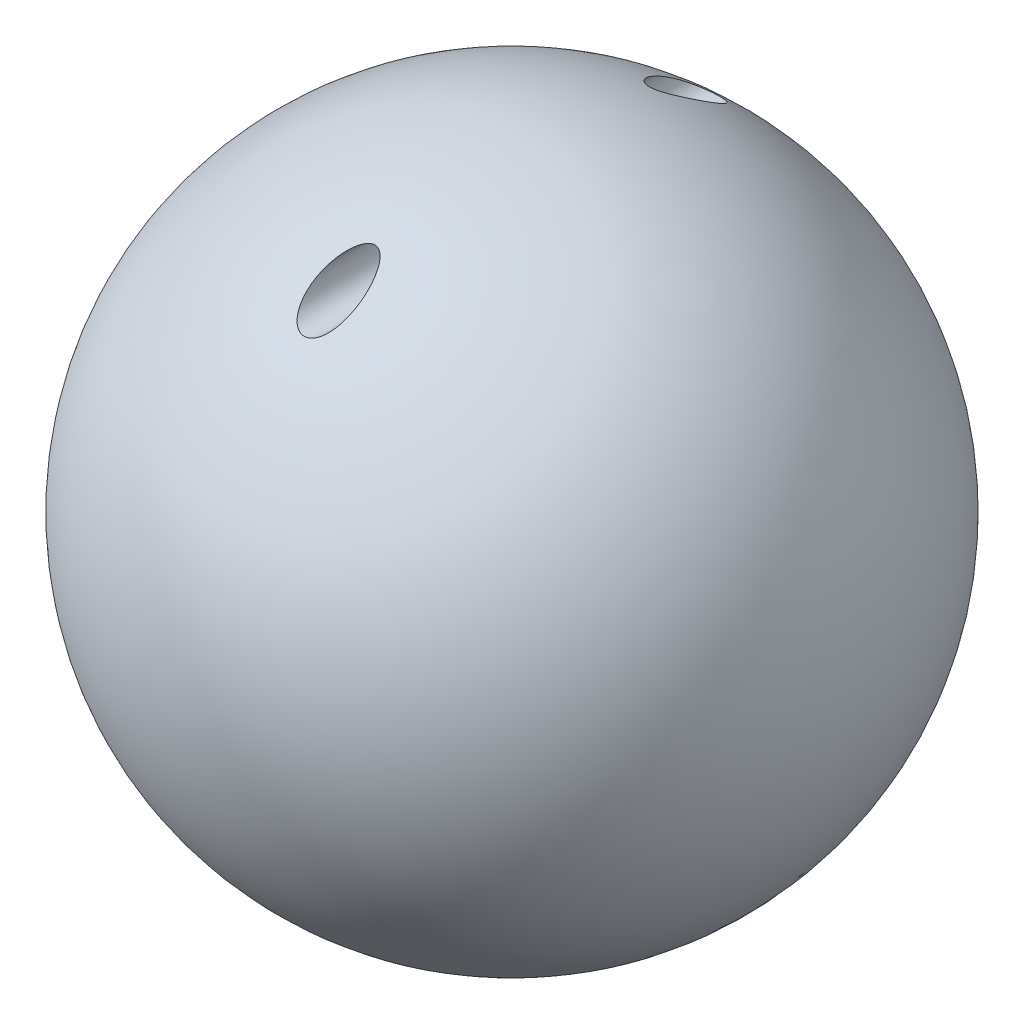
ISO-10303-21;
HEADER;
FILE_DESCRIPTION(('STEP AP214'),'2;1');
FILE_NAME('part.step','',(''),(''),'','','');
FILE_SCHEMA(('AUTOMOTIVE_DESIGN { 1 0 10303 214 1 1 1 1 }'));
ENDSEC;
DATA;
#1=APPLICATION_CONTEXT('core data for automotive mechanical design processes');
#2=APPLICATION_PROTOCOL_DEFINITION('international standard','automotive_design',2000,#1);
#3=PRODUCT_CONTEXT('',#1,'mechanical');
#4=PRODUCT('Part','Part','',(#3));
#5=PRODUCT_RELATED_PRODUCT_CATEGORY('part','',(#4));
#6=PRODUCT_DEFINITION_FORMATION('','',#4);
#7=PRODUCT_DEFINITION_CONTEXT('part definition',#1,'design');
#8=PRODUCT_DEFINITION('design','',#6,#7);
#9=PRODUCT_DEFINITION_SHAPE('','',#8);
#10=(LENGTH_UNIT() NAMED_UNIT(*) SI_UNIT(.MILLI.,.METRE.));
#11=(NAMED_UNIT(*) PLANE_ANGLE_UNIT() SI_UNIT($,.RADIAN.));
#12=(NAMED_UNIT(*) SI_UNIT($,.STERADIAN.) SOLID_ANGLE_UNIT());
#13=UNCERTAINTY_MEASURE_WITH_UNIT(LENGTH_MEASURE(1.E-05),#10,'distance_accuracy_value','');
#14=(GEOMETRIC_REPRESENTATION_CONTEXT(3) GLOBAL_UNCERTAINTY_ASSIGNED_CONTEXT((#13)) GLOBAL_UNIT_ASSIGNED_CONTEXT((#10,
#11,#12)) REPRESENTATION_CONTEXT('',''));
#15=CARTESIAN_POINT('',(0.,0.,0.));
#16=DIRECTION('',(0.,0.,1.));
#17=DIRECTION('',(1.,0.,0.));
#18=AXIS2_PLACEMENT_3D('',#15,#16,#17);
#19=CARTESIAN_POINT('',(0.,38.1,0.));
#20=DIRECTION('',(0.,-1.,0.));
#21=DIRECTION('',(-1.,0.,0.));
#22=AXIS2_PLACEMENT_3D('',#19,#20,#21);
#23=SPHERICAL_SURFACE('',#22,38.1);
#24=CARTESIAN_POINT('',(-0.956077152250891,67.8715067155588,-23.7561192860774));
#25=CARTESIAN_POINT('',(-1.08988025783361,67.9260513667573,-23.6823744984566));
#26=CARTESIAN_POINT('',(-1.21326743899603,67.9897236836018,-23.595944044695));
#27=CARTESIAN_POINT('',(-1.38245133822087,68.0936434214308,-23.4539327018622));
#28=CARTESIAN_POINT('',(-1.43636270429904,68.1298318840705,-23.4043320713231));
#29=CARTESIAN_POINT('',(-1.53915764986774,68.2044504216141,-23.3017100456448));
#30=CARTESIAN_POINT('',(-1.58804321973003,68.242879599602,-23.2486900183361));
#31=CARTESIAN_POINT('',(-1.70202474016501,68.3391710427908,-23.1153561187657));
#32=CARTESIAN_POINT('',(-1.76450351567185,68.3979894594724,-23.0335057768095));
#33=CARTESIAN_POINT('',(-1.88045133763182,68.5181334805811,-22.8653691468867));
#34=CARTESIAN_POINT('',(-1.93391528459052,68.5794604798503,-22.7790803839759));
#35=CARTESIAN_POINT('',(-2.03264306330124,68.7037600930996,-22.6031471870782));
#36=CARTESIAN_POINT('',(-2.07790945517654,68.7667321862571,-22.5135038113377));
#37=CARTESIAN_POINT('',(-2.16101294414045,68.8937556274515,-22.3315625238091));
#38=CARTESIAN_POINT('',(-2.19884752331048,68.957807333311,-22.2392637244569));
#39=CARTESIAN_POINT('',(-2.29023888619759,69.1286306175194,-21.9915274705454));
#40=CARTESIAN_POINT('',(-2.33789614720392,69.2359457952872,-21.8342739677283));
#41=CARTESIAN_POINT('',(-2.41685245858484,69.4508407739648,-21.5158571745261));
#42=CARTESIAN_POINT('',(-2.44814084014505,69.5584207016595,-21.3546914056439));
#43=CARTESIAN_POINT('',(-2.49601013077729,69.7730905387479,-21.0293581867958));
#44=CARTESIAN_POINT('',(-2.51255690877714,69.8801787428163,-20.8651846644854));
#45=CARTESIAN_POINT('',(-2.53198148905861,70.0928818619394,-20.5351700859443));
#46=CARTESIAN_POINT('',(-2.53486241295354,70.1984971079571,-20.3693294192043));
#47=CARTESIAN_POINT('',(-2.52751851368362,70.4140976934869,-20.0265871107531));
#48=CARTESIAN_POINT('',(-2.5164875012691,70.5239591243888,-19.849625143675));
#49=CARTESIAN_POINT('',(-2.48040047848942,70.7409347163667,-19.4953961426119));
#50=CARTESIAN_POINT('',(-2.45534115811606,70.8480482228238,-19.3181290464757));
#51=CARTESIAN_POINT('',(-2.39131570748102,71.0586750333275,-18.9647187651516));
#52=CARTESIAN_POINT('',(-2.35239269139198,71.1621984189663,-18.7885737998475));
#53=CARTESIAN_POINT('',(-2.26014717954414,71.3654118302454,-18.4379301276782));
#54=CARTESIAN_POINT('',(-2.20683173487314,71.4651037057566,-18.2634306578682));
#55=CARTESIAN_POINT('',(-2.08844568801798,71.6538760419011,-17.9282936795957));
#56=CARTESIAN_POINT('',(-2.02432660149554,71.7432294150276,-17.767475162239));
#57=CARTESIAN_POINT('',(-1.88041636778336,71.9174128740521,-17.4497752171573));
#58=CARTESIAN_POINT('',(-1.80059296837571,72.0022331866224,-17.2929026539372));
#59=CARTESIAN_POINT('',(-1.66643873781881,72.1251878592967,-17.0625112303771));
#60=CARTESIAN_POINT('',(-1.61905016889227,72.1656470283897,-16.9861731523278));
#61=CARTESIAN_POINT('',(-1.51887006636147,72.2447043462872,-16.8360299388582));
#62=CARTESIAN_POINT('',(-1.46607624275999,72.2833016960382,-16.7622258948397));
#63=CARTESIAN_POINT('',(-1.35458752922106,72.3580335293003,-16.6184195243858));
#64=CARTESIAN_POINT('',(-1.29591742205753,72.3941773602733,-16.548403002704));
#65=CARTESIAN_POINT('',(-1.17162964818109,72.4635011598668,-16.4133079929228));
#66=CARTESIAN_POINT('',(-1.10602053169808,72.4966846852828,-16.3482235934545));
#67=CARTESIAN_POINT('',(-0.97807408607205,72.5540611011198,-16.2350789965344));
#68=CARTESIAN_POINT('',(-0.916937849856174,72.5788386906545,-16.185971062397));
#69=CARTESIAN_POINT('',(-0.78839292538733,72.6247962537562,-16.0945216757323));
#70=CARTESIAN_POINT('',(-0.720980926854238,72.6459743118441,-16.0521838265889));
#71=CARTESIAN_POINT('',(-0.578809374054807,72.6837444235261,-15.9764367147104));
#72=CARTESIAN_POINT('',(-0.503967364939758,72.7002748065313,-15.943147698144));
#73=CARTESIAN_POINT('',(-0.348661235789467,72.7267702258622,-15.8896853658634));
#74=CARTESIAN_POINT('',(-0.268213097449586,72.7367531434783,-15.8694763304023));
#75=CARTESIAN_POINT('',(-0.122946008658491,72.7474728911945,-15.8477645101311));
#76=CARTESIAN_POINT('',(-0.0587199757540719,72.7497931186611,-15.8430588904829));
#77=CARTESIAN_POINT('',(0.0696810927183511,72.7495126502474,-15.8436275883465));
#78=CARTESIAN_POINT('',(0.133856132752681,72.7469124475783,-15.8489009055954));
#79=CARTESIAN_POINT('',(0.260063393490717,72.7370654442156,-15.8688423139614));
#80=CARTESIAN_POINT('',(0.322102852308137,72.7298364004488,-15.8834745028131));
#81=CARTESIAN_POINT('',(0.443057173689312,72.7113582192844,-15.9207940438785));
#82=CARTESIAN_POINT('',(0.501969637588753,72.7001060455674,-15.9434874799583));
#83=CARTESIAN_POINT('',(0.648806652580205,72.666879312794,-16.0103102284532));
#84=CARTESIAN_POINT('',(0.733966241505925,72.6424578612857,-16.05926587545));
#85=CARTESIAN_POINT('',(0.894910065134815,72.5878241645033,-16.1681591802658));
#86=CARTESIAN_POINT('',(0.9706643551324,72.5575941667441,-16.2281304794821));
#87=CARTESIAN_POINT('',(1.10594871198591,72.4965127604386,-16.3485445521747));
#88=CARTESIAN_POINT('',(1.1663474327003,72.4660788468249,-16.4082410688943));
#89=CARTESIAN_POINT('',(1.28123415097531,72.4026770420953,-16.5318759481599));
#90=CARTESIAN_POINT('',(1.33571725264701,72.3697070900749,-16.5958177547292));
#91=CARTESIAN_POINT('',(1.43953368702129,72.3017193648293,-16.7268733351472));
#92=CARTESIAN_POINT('',(1.48885899122986,72.2666985276316,-16.7939918246317));
#93=CARTESIAN_POINT('',(1.5828783884395,72.1949957149199,-16.9305619695714));
#94=CARTESIAN_POINT('',(1.62757070752124,72.1583131108018,-17.0000145053283));
#95=CARTESIAN_POINT('',(1.75538167045828,72.0462148094897,-17.2109184433276));
#96=CARTESIAN_POINT('',(1.83231201374387,71.968695836089,-17.3550181599252));
#97=CARTESIAN_POINT('',(1.97238944480632,71.8093188017222,-17.6474986711386));
#98=CARTESIAN_POINT('',(2.03552376912335,71.7274568090584,-17.7958832874993));
#99=CARTESIAN_POINT('',(2.14972617979511,71.5599765970286,-18.0956193554151));
#100=CARTESIAN_POINT('',(2.20076663405765,71.4743502957629,-18.2469767615496));
#101=CARTESIAN_POINT('',(2.29159470101053,71.3000152418782,-18.5512914442253));
#102=CARTESIAN_POINT('',(2.33137987661872,71.2113058263407,-18.7042490598332));
#103=CARTESIAN_POINT('',(2.41310582295312,70.9975264812231,-19.0683400165411));
#104=CARTESIAN_POINT('',(2.45029445643085,70.8712588019878,-19.2798495465002));
#105=CARTESIAN_POINT('',(2.504809915498,70.6144632183509,-19.7029856642031));
#106=CARTESIAN_POINT('',(2.52212558672937,70.483932963665,-19.9146122510487));
#107=CARTESIAN_POINT('',(2.53620430584941,70.2199105371503,-20.3359464122866));
#108=CARTESIAN_POINT('',(2.53302110002668,70.086427024635,-20.5456575624858));
#109=CARTESIAN_POINT('',(2.50470600197659,69.8173198385547,-20.9621000431658));
#110=CARTESIAN_POINT('',(2.47959222926129,69.6816980225156,-21.1688336904244));
#111=CARTESIAN_POINT('',(2.42302478402421,69.475880731701,-21.4781136500631));
#112=CARTESIAN_POINT('',(2.40057511186407,69.4059020377669,-21.5824935401686));
#113=CARTESIAN_POINT('',(2.3487049202285,69.2660722345682,-21.7895800752184));
#114=CARTESIAN_POINT('',(2.31928597250485,69.1962211001098,-21.8922870918652));
#115=CARTESIAN_POINT('',(2.25289223363604,69.0570076949248,-22.0955746720912));
#116=CARTESIAN_POINT('',(2.21591859388269,68.9876453513672,-22.1961555571343));
#117=CARTESIAN_POINT('',(2.13371718011195,68.8499292208662,-22.394539318396));
#118=CARTESIAN_POINT('',(2.08849125078148,68.7815752122069,-22.4923428098279));
#119=CARTESIAN_POINT('',(1.96272479114456,68.6109503127462,-22.7349375837164));
#120=CARTESIAN_POINT('',(1.87610552509777,68.5097007880551,-22.8774585350329));
#121=CARTESIAN_POINT('',(1.7275974338744,68.3634866994852,-23.0815130686968));
#122=CARTESIAN_POINT('',(1.6750297563965,68.3157149697603,-23.1478787125466));
#123=CARTESIAN_POINT('',(1.56315353580656,68.2227122597962,-23.2765584778395));
#124=CARTESIAN_POINT('',(1.50384868973993,68.1774799062339,-23.3388747921334));
#125=CARTESIAN_POINT('',(1.36237111134381,68.0796091030647,-23.4732114657097));
#126=CARTESIAN_POINT('',(1.27817103492847,68.0279076357888,-23.5438174034787));
#127=CARTESIAN_POINT('',(1.09778981405228,67.9321256090879,-23.6741160191359));
#128=CARTESIAN_POINT('',(1.00162493260936,67.8880348954239,-23.7338232442588));
#129=CARTESIAN_POINT('',(0.817573843796583,67.8181056997736,-23.8282446911651));
#130=CARTESIAN_POINT('',(0.731758927543794,67.7903835810579,-23.865563809465));
#131=CARTESIAN_POINT('',(0.553619868798758,67.7436619264792,-23.9283567776533));
#132=CARTESIAN_POINT('',(0.461301183896006,67.7246551754309,-23.9538404259896));
#133=CARTESIAN_POINT('',(0.271612108284033,67.6968963517942,-23.9910307629647));
#134=CARTESIAN_POINT('',(0.174208753300914,67.6882230343145,-24.002631648614));
#135=CARTESIAN_POINT('',(-0.0215730424942193,67.6823269858007,-24.0105198065994));
#136=CARTESIAN_POINT('',(-0.119951238235744,67.6851014462249,-24.0068108349806));
#137=CARTESIAN_POINT('',(-0.302353056558344,67.7007699106189,-23.9858388441149));
#138=CARTESIAN_POINT('',(-0.386689312509422,67.7124175197854,-23.9702451362648));
#139=CARTESIAN_POINT('',(-0.551222896837466,67.7434194499842,-23.9286703599963));
#140=CARTESIAN_POINT('',(-0.631421687979475,67.7627710259597,-23.9026929914425));
#141=CARTESIAN_POINT('',(-0.751832248752979,67.7978699933195,-23.8554724034767));
#142=CARTESIAN_POINT('',(-0.793948526645847,67.8113855291012,-23.8372715457935));
#143=CARTESIAN_POINT('',(-0.876368918637927,67.8401735199978,-23.7984520898788));
#144=CARTESIAN_POINT('',(-0.916674665362088,67.8554443461964,-23.777835732902));
#145=CARTESIAN_POINT('',(-0.956077152250891,67.8715067155588,-23.7561192860774));
#146=B_SPLINE_CURVE_WITH_KNOTS('',3,(#24,#25,#26,#27,#28,#29,#30,#31,#32,#33,#34,#35,#36,#37,
#38,#39,#40,#41,#42,#43,#44,#45,#46,#47,#48,#49,#50,#51,#52,#53,#54,#55,#56,#57,#58,#59,#60,#61,
#62,#63,#64,#65,#66,#67,#68,#69,#70,#71,#72,#73,#74,#75,#76,#77,#78,#79,#80,#81,#82,#83,#84,#85,
#86,#87,#88,#89,#90,#91,#92,#93,#94,#95,#96,#97,#98,#99,#100,#101,#102,#103,#104,#105,#106,#107,
#108,#109,#110,#111,#112,#113,#114,#115,#116,#117,#118,#119,#120,#121,#122,#123,#124,#125,#126,
#127,#128,#129,#130,#131,#132,#133,#134,#135,#136,#137,#138,#139,#140,#141,#142,#143,#144,#145),
.UNSPECIFIED.,.T.,.F.,(4,2,2,2,2,2,2,2,2,2,2,2,2,2,2,2,2,2,2,2,2,2,2,2,2,2,2,2,2,2,2,2,2,2,2,2,
2,2,2,2,2,2,2,2,2,2,2,2,2,2,2,2,2,2,2,2,2,2,2,2,4),(0.,0.48641947934676,0.731412208073252,
0.976307535237751,1.33151600304147,1.68692473538572,2.04222228028265,2.39763999412192,
2.98549446777267,3.5737316139951,4.16332718612942,4.75278807381398,5.37803167608795,
6.00342286809922,6.62688592161603,7.25004408291804,7.833965825301,8.4190995375056,
8.71456632194752,9.01015880632031,9.30455332357016,9.59858922412656,9.84483993152131,
10.0912212729291,10.3407322595241,10.5895589561794,10.7819576421185,10.9743370435318,
11.1659828345087,11.3577735699506,11.6596902033161,11.9625446903611,12.232785040682,
12.503247369576,12.7741246152118,13.0451051966496,13.5866526542665,14.1286990258876,
14.671972174575,15.2153628671935,15.9618505007514,16.7087569206143,17.4537058150016,
18.1980397981132,18.5808444865357,18.9635629246565,19.3462230770623,19.7287977955614,
20.3120994106875,20.6034530563816,20.8946475860639,21.2578977322004,21.6206594211137,
21.912324244265,22.2037471691715,22.4973772163966,22.7909352301506,23.0494814176518,
23.3079355630102,23.4513089034757,23.5945502510808),.UNSPECIFIED.);
#147=CARTESIAN_POINT('',(-0.956077152250891,67.8715067155588,-23.7561192860774));
#148=VERTEX_POINT('',#147);
#149=EDGE_CURVE('E10',#148,#148,#146,.T.);
#150=ORIENTED_EDGE('',*,*,#149,.F.);
#151=EDGE_LOOP('',(#150));
#152=FACE_BOUND('',#151,.T.);
#153=CARTESIAN_POINT('',(-0.994738307856491,72.5461415537531,16.2506562254478));
#154=CARTESIAN_POINT('',(-1.07291557390278,72.5127577977565,16.3166333520263));
#155=CARTESIAN_POINT('',(-1.14617336766777,72.4768420136395,16.3872080872959));
#156=CARTESIAN_POINT('',(-1.28422559905736,72.4013533222182,16.5344967045047));
#157=CARTESIAN_POINT('',(-1.34900321399339,72.3617734037816,16.6112223166157));
#158=CARTESIAN_POINT('',(-1.4716986376198,72.2795363138753,16.7694721903049));
#159=CARTESIAN_POINT('',(-1.52956056553212,72.2368580399368,16.851028492122));
#160=CARTESIAN_POINT('',(-1.63885207238568,72.1492408322564,17.0172026690568));
#161=CARTESIAN_POINT('',(-1.69027819523971,72.1043007018844,17.1018221579571));
#162=CARTESIAN_POINT('',(-1.82390331357097,71.9781411805637,17.3375628218374));
#163=CARTESIAN_POINT('',(-1.90025984947556,71.8949877568207,17.4909684193262));
#164=CARTESIAN_POINT('',(-2.03838929695356,71.7241807925285,17.8018460774115));
#165=CARTESIAN_POINT('',(-2.10014901224253,71.6365232665175,17.9593216759284));
#166=CARTESIAN_POINT('',(-2.21054924512755,71.4576202413171,18.2764540849225));
#167=CARTESIAN_POINT('',(-2.2592088399394,71.3663801837117,18.4361073639596));
#168=CARTESIAN_POINT('',(-2.34442131943875,71.1807475577334,18.7567041702282));
#169=CARTESIAN_POINT('',(-2.38097813201117,71.0863560231232,18.9176472614568));
#170=CARTESIAN_POINT('',(-2.44558947940395,70.884953570257,19.256682594363));
#171=CARTESIAN_POINT('',(-2.4723840534328,70.7776427245922,19.4348373457619));
#172=CARTESIAN_POINT('',(-2.5118335343398,70.560136878119,19.7910118290448));
#173=CARTESIAN_POINT('',(-2.52448498290484,70.4499411786373,19.9690315172732));
#174=CARTESIAN_POINT('',(-2.53519325000556,70.2273372379979,20.3238986839107));
#175=CARTESIAN_POINT('',(-2.53326397607794,70.1149312071931,20.5007471183479));
#176=CARTESIAN_POINT('',(-2.51395391039261,69.8884747239421,20.8524992262387));
#177=CARTESIAN_POINT('',(-2.49657919673583,69.7744249357151,21.0274036372953));
#178=CARTESIAN_POINT('',(-2.45383404422005,69.5848024042859,21.3146624351409));
#179=CARTESIAN_POINT('',(-2.43325226549391,69.5094538894815,21.4278883568147));
#180=CARTESIAN_POINT('',(-2.38427284559108,69.3587356397535,21.6526115583047));
#181=CARTESIAN_POINT('',(-2.35587667071312,69.2833659114583,21.7641091582825));
#182=CARTESIAN_POINT('',(-2.29060081062474,69.1330233614997,21.9848468619308));
#183=CARTESIAN_POINT('',(-2.2537238069447,69.0580504220259,22.0940876672976));
#184=CARTESIAN_POINT('',(-2.1706683398258,68.9090781852226,22.3095898576937));
#185=CARTESIAN_POINT('',(-2.12449267792224,68.8350786017731,22.4158521291482));
#186=CARTESIAN_POINT('',(-1.99986309462129,68.6574809829385,22.6691255421255));
#187=CARTESIAN_POINT('',(-1.91603959595539,68.5547087717911,22.814203290912));
#188=CARTESIAN_POINT('',(-1.77187819252635,68.4057872156235,23.0225828264115));
#189=CARTESIAN_POINT('',(-1.72078025786185,68.357040066591,23.0904749322538));
#190=CARTESIAN_POINT('',(-1.61188904175574,68.261910948522,23.2224139172333));
#191=CARTESIAN_POINT('',(-1.5540990279903,68.2155278409486,23.2864626500497));
#192=CARTESIAN_POINT('',(-1.41374458112809,68.1131357398755,23.4273093725589));
#193=CARTESIAN_POINT('',(-1.32881363000188,68.0581512436138,23.5025379672505));
#194=CARTESIAN_POINT('',(-1.14612473518696,67.9558685268491,23.6418966893701));
#195=CARTESIAN_POINT('',(-1.04838503901721,67.9085595822724,23.7060423099163));
#196=CARTESIAN_POINT('',(-0.86239132583445,67.833833525209,23.8070408687618));
#197=CARTESIAN_POINT('',(-0.776575303209441,67.8043260341478,23.8467968649327));
#198=CARTESIAN_POINT('',(-0.597967796521929,67.7539818662425,23.9145045672499));
#199=CARTESIAN_POINT('',(-0.505181953819884,67.7331382642737,23.9424657014021));
#200=CARTESIAN_POINT('',(-0.313896613379384,67.7017712002652,23.984505949947));
#201=CARTESIAN_POINT('',(-0.215355495824669,67.6913363405069,23.9984658874251));
#202=CARTESIAN_POINT('',(-0.0167756037442834,67.6822350986743,24.0106432304967));
#203=CARTESIAN_POINT('',(0.0832622752208,67.6835619398384,24.0088697012711));
#204=CARTESIAN_POINT('',(0.26804881922397,67.6968692677946,23.9910605786708));
#205=CARTESIAN_POINT('',(0.353094173883818,67.7074420821182,23.9769093942994));
#206=CARTESIAN_POINT('',(0.519278957000364,67.736492112611,23.9379653969262));
#207=CARTESIAN_POINT('',(0.600416824482984,67.7549724590355,23.9131683696752));
#208=CARTESIAN_POINT('',(0.783463500297595,67.8059025381686,23.8446813843953));
#209=CARTESIAN_POINT('',(0.883317812129635,67.8409534930817,23.7974516809947));
#210=CARTESIAN_POINT('',(1.07222404105023,67.919984259898,23.6905525971068));
#211=CARTESIAN_POINT('',(1.16125412061696,67.9639816585097,23.6308587085124));
#212=CARTESIAN_POINT('',(1.36866615100792,68.0810350366109,23.4713336481839));
#213=CARTESIAN_POINT('',(1.48061818942756,68.1579006590872,23.3659919743153));
#214=CARTESIAN_POINT('',(1.68326990014178,68.3199450453692,23.1421914981547));
#215=CARTESIAN_POINT('',(1.7739217059996,68.4051419347958,23.0237040168203));
#216=CARTESIAN_POINT('',(1.92251984902798,68.5650601083861,22.7994315274766));
#217=CARTESIAN_POINT('',(1.98341220300288,68.6390273557812,22.6950197038176));
#218=CARTESIAN_POINT('',(2.09398389654307,68.7890161333324,22.4817611861053));
#219=CARTESIAN_POINT('',(2.14365604651528,68.8650389459057,22.3729117009508));
#220=CARTESIAN_POINT('',(2.23296055697538,69.0182819895295,22.1518358615886));
#221=CARTESIAN_POINT('',(2.27258202466151,69.0955034242932,22.039605989835));
#222=CARTESIAN_POINT('',(2.34267476241167,69.2504493345508,21.8126454973948));
#223=CARTESIAN_POINT('',(2.37314309310235,69.3281739634688,21.697914086041));
#224=CARTESIAN_POINT('',(2.44139869540917,69.5300965890916,21.3974276605402));
#225=CARTESIAN_POINT('',(2.47268257534729,69.6543157213037,21.2101937721607));
#226=CARTESIAN_POINT('',(2.51617689390972,69.9014505741104,20.8326196261311));
#227=CARTESIAN_POINT('',(2.52837535169992,70.0243654279074,20.642277492969));
#228=CARTESIAN_POINT('',(2.53519035287861,70.2682237161546,20.259315624831));
#229=CARTESIAN_POINT('',(2.5297588737051,70.3891608625849,20.0666910953053));
#230=CARTESIAN_POINT('',(2.50207890963118,70.6279255428172,19.6808361040425));
#231=CARTESIAN_POINT('',(2.47983646013261,70.7457541769159,19.4876058845454));
#232=CARTESIAN_POINT('',(2.41762832671549,70.9820515311158,19.0942757596613));
#233=CARTESIAN_POINT('',(2.37702801466943,71.1003779008845,18.8941905825788));
#234=CARTESIAN_POINT('',(2.2773941153449,71.3324026373736,18.4955825753448));
#235=CARTESIAN_POINT('',(2.21834362538189,71.4460966518716,18.2970613496373));
#236=CARTESIAN_POINT('',(2.1147175833009,71.6122847568578,18.002185347633));
#237=CARTESIAN_POINT('',(2.07766683387201,71.6669557189341,17.9043768945997));
#238=CARTESIAN_POINT('',(1.99816995055729,71.7746824111636,17.7100816313264));
#239=CARTESIAN_POINT('',(1.95572492203779,71.827738469481,17.6135945547916));
#240=CARTESIAN_POINT('',(1.86503314218825,71.931919796655,17.4225922072272));
#241=CARTESIAN_POINT('',(1.8167978298545,71.9830486184723,17.3280734676344));
#242=CARTESIAN_POINT('',(1.71376981305961,72.0831896171169,17.1414609051546));
#243=CARTESIAN_POINT('',(1.65897601187086,72.1322014380638,17.0493674909871));
#244=CARTESIAN_POINT('',(1.5490278534616,72.2218411152492,16.879608314696));
#245=CARTESIAN_POINT('',(1.49472630703451,72.2627640666159,16.8015491706288));
#246=CARTESIAN_POINT('',(1.37955556724532,72.3421271122396,16.6491513685294));
#247=CARTESIAN_POINT('',(1.31869152266912,72.3805691156762,16.5748098598046));
#248=CARTESIAN_POINT('',(1.18988813870633,72.4539716021535,16.4319598902069));
#249=CARTESIAN_POINT('',(1.12201638946625,72.4889599567781,16.363405514979));
#250=CARTESIAN_POINT('',(0.977667230928687,72.554700386339,16.2338606188401));
#251=CARTESIAN_POINT('',(0.901210620445715,72.5854623148407,16.1728525386802));
#252=CARTESIAN_POINT('',(0.760888948531542,72.6334673120492,16.0771949192128));
#253=CARTESIAN_POINT('',(0.699322391868243,72.6521040918639,16.0399054455216));
#254=CARTESIAN_POINT('',(0.570934989876114,72.6853598732916,15.9731781713361));
#255=CARTESIAN_POINT('',(0.504113054506532,72.6999780385449,15.9437420053208));
#256=CARTESIAN_POINT('',(0.365057306868959,72.7242141794348,15.8948470853099));
#257=CARTESIAN_POINT('',(0.292770611975053,72.7337734294015,15.8755055474069));
#258=CARTESIAN_POINT('',(0.145424578613778,72.7465555281145,15.849626517799));
#259=CARTESIAN_POINT('',(0.0703701613346359,72.7497891185802,15.8430673202375));
#260=CARTESIAN_POINT('',(-0.071725181757938,72.7495342254474,15.8435835542501));
#261=CARTESIAN_POINT('',(-0.138776379756317,72.7467187575708,15.8492938876856));
#262=CARTESIAN_POINT('',(-0.270808305829471,72.7360127917594,15.8709732866092));
#263=CARTESIAN_POINT('',(-0.335786433043655,72.7281161630118,15.8869547449744));
#264=CARTESIAN_POINT('',(-0.479445732083496,72.7052013438393,15.9332193355331));
#265=CARTESIAN_POINT('',(-0.557020761001992,72.6888269381747,15.9662168472918));
#266=CARTESIAN_POINT('',(-0.705255714668965,72.6506974929158,16.0427322078753));
#267=CARTESIAN_POINT('',(-0.775908508546123,72.6289369845634,16.0862607483193));
#268=CARTESIAN_POINT('',(-0.86943601179199,72.5959180539007,16.1519918562723));
#269=CARTESIAN_POINT('',(-0.895216102700538,72.5863292744136,16.1710482238608));
#270=CARTESIAN_POINT('',(-0.94573367617114,72.5666214982065,16.2101420518864));
#271=CARTESIAN_POINT('',(-0.970472965849849,72.5565034952445,16.2301776691871));
#272=CARTESIAN_POINT('',(-0.994738307856491,72.5461415537531,16.2506562254478));
#273=B_SPLINE_CURVE_WITH_KNOTS('',3,(#153,#154,#155,#156,#157,#158,#159,#160,#161,#162,#163,
#164,#165,#166,#167,#168,#169,#170,#171,#172,#173,#174,#175,#176,#177,#178,#179,#180,#181,#182,
#183,#184,#185,#186,#187,#188,#189,#190,#191,#192,#193,#194,#195,#196,#197,#198,#199,#200,#201,
#202,#203,#204,#205,#206,#207,#208,#209,#210,#211,#212,#213,#214,#215,#216,#217,#218,#219,#220,
#221,#222,#223,#224,#225,#226,#227,#228,#229,#230,#231,#232,#233,#234,#235,#236,#237,#238,#239,
#240,#241,#242,#243,#244,#245,#246,#247,#248,#249,#250,#251,#252,#253,#254,#255,#256,#257,#258,
#259,#260,#261,#262,#263,#264,#265,#266,#267,#268,#269,#270,#271,#272),.UNSPECIFIED.,.T.,.F.,(4,
2,2,2,2,2,2,2,2,2,2,2,2,2,2,2,2,2,2,2,2,2,2,2,2,2,2,2,2,2,2,2,2,2,2,2,2,2,2,2,2,2,2,2,2,2,2,2,2,
2,2,2,2,2,2,2,2,2,2,4),(0.,0.322763274451063,0.646157434323218,0.972009583388606,
1.29803597399008,1.86854643253811,2.43957070602261,3.00975886404925,3.57976178913118,
4.20834678364842,4.83708544777529,5.4652244775777,6.09311643101083,6.50557811775081,
6.91796246260255,7.33021659559644,7.74234670841805,8.33011342317946,8.62373497708676,
8.91721375828544,9.2943410930034,9.67093689152285,9.96703623336317,10.2628984430823,
10.561258160548,10.8594459827077,11.1188619345185,11.3783806732084,11.7241153303443,
12.0705363115202,12.5832781261217,13.0971613968564,13.5216994838073,13.9465088360535,
14.3717766429357,14.7971808716699,15.4767505911933,16.1567467382795,16.8385966941752,
17.5202019714605,18.2274220183646,18.9352918769908,19.2892323784022,19.6431004688402,
19.9962806372428,20.3495199480836,20.6598374941932,20.9699133198892,21.2772371119727,
21.583831783437,21.8063303167303,22.0288751217322,22.2539495818632,22.4786415059668,
22.6796348464006,22.880871156723,23.1370848729495,23.3935598096607,23.4939240213583,
23.5941061028998),.UNSPECIFIED.);
#274=CARTESIAN_POINT('',(-0.994738307856491,72.5461415537531,16.2506562254478));
#275=VERTEX_POINT('',#274);
#276=EDGE_CURVE('E54',#275,#275,#273,.T.);
#277=ORIENTED_EDGE('',*,*,#276,.F.);
#278=EDGE_LOOP('',(#277));
#279=FACE_BOUND('',#278,.T.);
#280=ADVANCED_FACE('F43',(#152,#279),#23,.T.);
#281=CARTESIAN_POINT('',(0.,70.2168918752966,-38.1));
#282=DIRECTION('',(0.,0.,1.));
#283=DIRECTION('',(1.,0.,0.));
#284=AXIS2_PLACEMENT_3D('',#281,#282,#283);
#285=CYLINDRICAL_SURFACE('',#284,2.53276693868716);
#286=ORIENTED_EDGE('',*,*,#149,.T.);
#287=EDGE_LOOP('',(#286));
#288=FACE_BOUND('',#287,.T.);
#289=ORIENTED_EDGE('',*,*,#276,.T.);
#290=EDGE_LOOP('',(#289));
#291=FACE_BOUND('',#290,.T.);
#292=ADVANCED_FACE('F64',(#288,#291),#285,.F.);
#293=CLOSED_SHELL('',(#280,#292));
#294=MANIFOLD_SOLID_BREP('B2',#293);
#295=ADVANCED_BREP_SHAPE_REPRESENTATION('',(#18,#294),#14);
#296=SHAPE_DEFINITION_REPRESENTATION(#9,#295);
ENDSEC;
END-ISO-10303-21;
